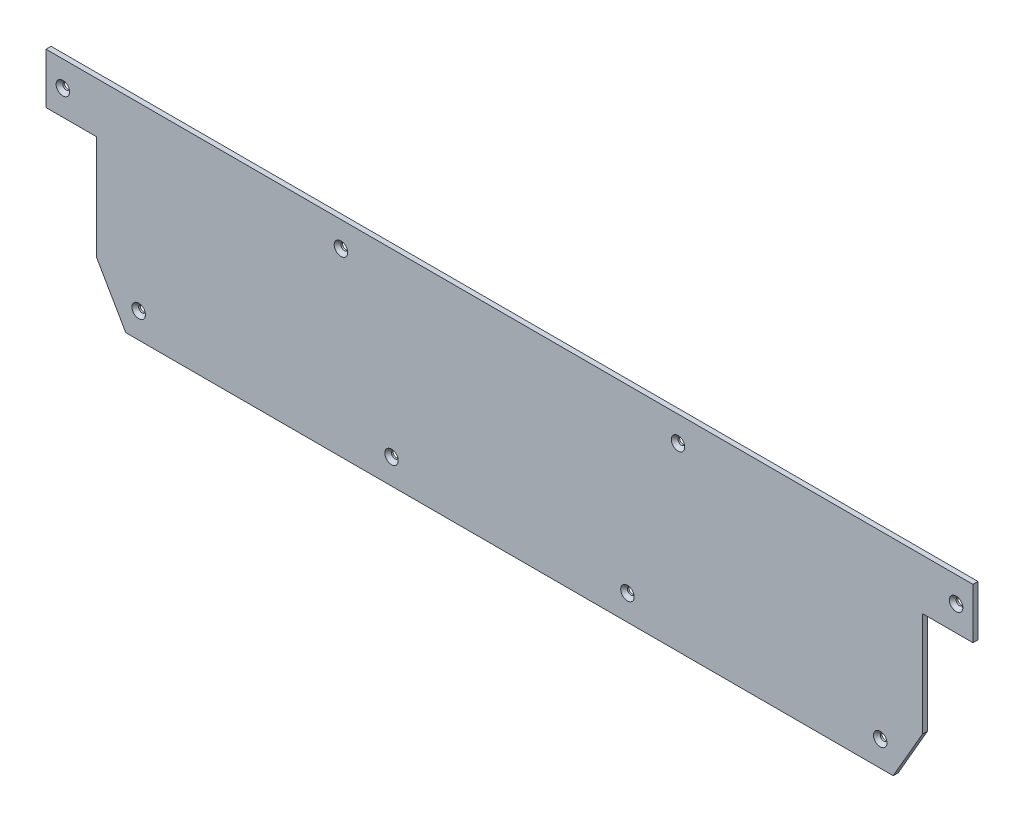
ISO-10303-21;
HEADER;
FILE_DESCRIPTION(('STEP AP214'),'2;1');
FILE_NAME('part.step','',(''),(''),'','','');
FILE_SCHEMA(('AUTOMOTIVE_DESIGN { 1 0 10303 214 1 1 1 1 }'));
ENDSEC;
DATA;
#1=APPLICATION_CONTEXT('core data for automotive mechanical design processes');
#2=APPLICATION_PROTOCOL_DEFINITION('international standard','automotive_design',2000,#1);
#3=PRODUCT_CONTEXT('',#1,'mechanical');
#4=PRODUCT('Part','Part','',(#3));
#5=PRODUCT_RELATED_PRODUCT_CATEGORY('part','',(#4));
#6=PRODUCT_DEFINITION_FORMATION('','',#4);
#7=PRODUCT_DEFINITION_CONTEXT('part definition',#1,'design');
#8=PRODUCT_DEFINITION('design','',#6,#7);
#9=PRODUCT_DEFINITION_SHAPE('','',#8);
#10=(LENGTH_UNIT() NAMED_UNIT(*) SI_UNIT(.MILLI.,.METRE.));
#11=(NAMED_UNIT(*) PLANE_ANGLE_UNIT() SI_UNIT($,.RADIAN.));
#12=(NAMED_UNIT(*) SI_UNIT($,.STERADIAN.) SOLID_ANGLE_UNIT());
#13=UNCERTAINTY_MEASURE_WITH_UNIT(LENGTH_MEASURE(1.E-05),#10,'distance_accuracy_value','');
#14=(GEOMETRIC_REPRESENTATION_CONTEXT(3) GLOBAL_UNCERTAINTY_ASSIGNED_CONTEXT((#13)) GLOBAL_UNIT_ASSIGNED_CONTEXT((#10,
#11,#12)) REPRESENTATION_CONTEXT('',''));
#15=CARTESIAN_POINT('',(0.,0.,0.));
#16=DIRECTION('',(0.,0.,1.));
#17=DIRECTION('',(1.,0.,0.));
#18=AXIS2_PLACEMENT_3D('',#15,#16,#17);
#19=CARTESIAN_POINT('',(-275.,61.,3.));
#20=DIRECTION('',(1.,0.,0.));
#21=DIRECTION('',(0.,0.,-1.));
#22=AXIS2_PLACEMENT_3D('',#19,#20,#21);
#23=PLANE('',#22);
#24=DIRECTION('',(0.,-1.,0.));
#25=VECTOR('',#24,1.);
#26=CARTESIAN_POINT('',(-275.,61.,0.));
#27=LINE('',#26,#25);
#28=CARTESIAN_POINT('',(-275.,61.,0.));
#29=VERTEX_POINT('',#28);
#30=CARTESIAN_POINT('',(-275.,31.,0.));
#31=VERTEX_POINT('',#30);
#32=EDGE_CURVE('E138',#29,#31,#27,.T.);
#33=ORIENTED_EDGE('',*,*,#32,.T.);
#34=DIRECTION('',(0.,0.,1.));
#35=VECTOR('',#34,1.);
#36=CARTESIAN_POINT('',(-275.,31.,0.));
#37=LINE('',#36,#35);
#38=CARTESIAN_POINT('',(-275.,31.,3.));
#39=VERTEX_POINT('',#38);
#40=EDGE_CURVE('E143',#31,#39,#37,.T.);
#41=ORIENTED_EDGE('',*,*,#40,.T.);
#42=DIRECTION('',(0.,-1.,0.));
#43=VECTOR('',#42,1.);
#44=CARTESIAN_POINT('',(-275.,61.,3.));
#45=LINE('',#44,#43);
#46=CARTESIAN_POINT('',(-275.,61.,3.));
#47=VERTEX_POINT('',#46);
#48=EDGE_CURVE('E148',#47,#39,#45,.T.);
#49=ORIENTED_EDGE('',*,*,#48,.F.);
#50=DIRECTION('',(0.,0.,-1.));
#51=VECTOR('',#50,1.);
#52=CARTESIAN_POINT('',(-275.,61.,3.));
#53=LINE('',#52,#51);
#54=EDGE_CURVE('E149',#47,#29,#53,.T.);
#55=ORIENTED_EDGE('',*,*,#54,.T.);
#56=EDGE_LOOP('',(#33,#41,#49,#55));
#57=FACE_BOUND('',#56,.T.);
#58=ADVANCED_FACE('F36',(#57),#23,.F.);
#59=CARTESIAN_POINT('',(-275.,-61.,3.));
#60=DIRECTION('',(0.,1.,0.));
#61=DIRECTION('',(0.,0.,1.));
#62=AXIS2_PLACEMENT_3D('',#59,#60,#61);
#63=PLANE('',#62);
#64=DIRECTION('',(1.,0.,0.));
#65=VECTOR('',#64,1.);
#66=CARTESIAN_POINT('',(-275.,-61.,3.));
#67=LINE('',#66,#65);
#68=CARTESIAN_POINT('',(-227.679491924311,-61.,3.));
#69=VERTEX_POINT('',#68);
#70=CARTESIAN_POINT('',(227.679491924311,-60.9999999999999,3.));
#71=VERTEX_POINT('',#70);
#72=EDGE_CURVE('E131',#69,#71,#67,.T.);
#73=ORIENTED_EDGE('',*,*,#72,.F.);
#74=DIRECTION('',(0.,0.,1.));
#75=VECTOR('',#74,1.);
#76=CARTESIAN_POINT('',(-227.679491924311,-61.,0.));
#77=LINE('',#76,#75);
#78=CARTESIAN_POINT('',(-227.679491924311,-61.,0.));
#79=VERTEX_POINT('',#78);
#80=EDGE_CURVE('E118',#79,#69,#77,.T.);
#81=ORIENTED_EDGE('',*,*,#80,.F.);
#82=DIRECTION('',(1.,0.,0.));
#83=VECTOR('',#82,1.);
#84=CARTESIAN_POINT('',(-275.,-61.,0.));
#85=LINE('',#84,#83);
#86=CARTESIAN_POINT('',(227.679491924311,-61.,0.));
#87=VERTEX_POINT('',#86);
#88=EDGE_CURVE('E129',#79,#87,#85,.T.);
#89=ORIENTED_EDGE('',*,*,#88,.T.);
#90=DIRECTION('',(0.,0.,1.));
#91=VECTOR('',#90,1.);
#92=CARTESIAN_POINT('',(227.679491924311,-60.9999999999999,0.));
#93=LINE('',#92,#91);
#94=EDGE_CURVE('E60',#87,#71,#93,.T.);
#95=ORIENTED_EDGE('',*,*,#94,.T.);
#96=EDGE_LOOP('',(#73,#81,#89,#95));
#97=FACE_BOUND('',#96,.T.);
#98=ADVANCED_FACE('F128',(#97),#63,.F.);
#99=CARTESIAN_POINT('',(275.,61.,3.));
#100=DIRECTION('',(-1.,0.,0.));
#101=DIRECTION('',(0.,0.,1.));
#102=AXIS2_PLACEMENT_3D('',#99,#100,#101);
#103=PLANE('',#102);
#104=DIRECTION('',(0.,1.,0.));
#105=VECTOR('',#104,1.);
#106=CARTESIAN_POINT('',(275.,61.,3.));
#107=LINE('',#106,#105);
#108=CARTESIAN_POINT('',(275.,31.0000000000001,3.));
#109=VERTEX_POINT('',#108);
#110=CARTESIAN_POINT('',(275.,61.,3.));
#111=VERTEX_POINT('',#110);
#112=EDGE_CURVE('E258',#109,#111,#107,.T.);
#113=ORIENTED_EDGE('',*,*,#112,.F.);
#114=DIRECTION('',(0.,0.,1.));
#115=VECTOR('',#114,1.);
#116=CARTESIAN_POINT('',(275.,31.0000000000001,0.));
#117=LINE('',#116,#115);
#118=CARTESIAN_POINT('',(275.,31.0000000000001,0.));
#119=VERTEX_POINT('',#118);
#120=EDGE_CURVE('E252',#119,#109,#117,.T.);
#121=ORIENTED_EDGE('',*,*,#120,.F.);
#122=DIRECTION('',(0.,1.,0.));
#123=VECTOR('',#122,1.);
#124=CARTESIAN_POINT('',(275.,61.,0.));
#125=LINE('',#124,#123);
#126=CARTESIAN_POINT('',(275.,61.,0.));
#127=VERTEX_POINT('',#126);
#128=EDGE_CURVE('E137',#119,#127,#125,.T.);
#129=ORIENTED_EDGE('',*,*,#128,.T.);
#130=DIRECTION('',(0.,0.,-1.));
#131=VECTOR('',#130,1.);
#132=CARTESIAN_POINT('',(275.,61.,3.));
#133=LINE('',#132,#131);
#134=EDGE_CURVE('E152',#111,#127,#133,.T.);
#135=ORIENTED_EDGE('',*,*,#134,.F.);
#136=EDGE_LOOP('',(#113,#121,#129,#135));
#137=FACE_BOUND('',#136,.T.);
#138=ADVANCED_FACE('F283',(#137),#103,.F.);
#139=CARTESIAN_POINT('',(-275.,61.,3.));
#140=DIRECTION('',(0.,-1.,0.));
#141=DIRECTION('',(0.,0.,-1.));
#142=AXIS2_PLACEMENT_3D('',#139,#140,#141);
#143=PLANE('',#142);
#144=DIRECTION('',(-1.,0.,0.));
#145=VECTOR('',#144,1.);
#146=CARTESIAN_POINT('',(-275.,61.,0.));
#147=LINE('',#146,#145);
#148=EDGE_CURVE('E140',#127,#29,#147,.T.);
#149=ORIENTED_EDGE('',*,*,#148,.T.);
#150=ORIENTED_EDGE('',*,*,#54,.F.);
#151=DIRECTION('',(-1.,0.,0.));
#152=VECTOR('',#151,1.);
#153=CARTESIAN_POINT('',(-275.,61.,3.));
#154=LINE('',#153,#152);
#155=EDGE_CURVE('E153',#111,#47,#154,.T.);
#156=ORIENTED_EDGE('',*,*,#155,.F.);
#157=ORIENTED_EDGE('',*,*,#134,.T.);
#158=EDGE_LOOP('',(#149,#150,#156,#157));
#159=FACE_BOUND('',#158,.T.);
#160=ADVANCED_FACE('F212',(#159),#143,.F.);
#161=CARTESIAN_POINT('',(0.,0.,3.));
#162=DIRECTION('',(0.,0.,1.));
#163=DIRECTION('',(1.,0.,0.));
#164=AXIS2_PLACEMENT_3D('',#161,#162,#163);
#165=PLANE('',#164);
#166=CARTESIAN_POINT('',(70.,-46.,3.));
#167=DIRECTION('',(0.,0.,1.));
#168=DIRECTION('',(1.,0.,0.));
#169=AXIS2_PLACEMENT_3D('',#166,#167,#168);
#170=CIRCLE('',#169,3.99999999999989);
#171=CARTESIAN_POINT('',(73.9999999999999,-46.,3.));
#172=VERTEX_POINT('',#171);
#173=EDGE_CURVE('E177',#172,#172,#170,.F.);
#174=ORIENTED_EDGE('',*,*,#173,.T.);
#175=EDGE_LOOP('',(#174));
#176=FACE_BOUND('',#175,.T.);
#177=CARTESIAN_POINT('',(220.,-46.,3.));
#178=DIRECTION('',(0.,0.,1.));
#179=DIRECTION('',(1.,0.,0.));
#180=AXIS2_PLACEMENT_3D('',#177,#178,#179);
#181=CIRCLE('',#180,4.);
#182=CARTESIAN_POINT('',(224.,-46.,3.));
#183=VERTEX_POINT('',#182);
#184=EDGE_CURVE('E174',#183,#183,#181,.F.);
#185=ORIENTED_EDGE('',*,*,#184,.T.);
#186=EDGE_LOOP('',(#185));
#187=FACE_BOUND('',#186,.T.);
#188=CARTESIAN_POINT('',(265.,46.0000000000001,3.));
#189=DIRECTION('',(0.,0.,1.));
#190=DIRECTION('',(1.,0.,0.));
#191=AXIS2_PLACEMENT_3D('',#188,#189,#190);
#192=CIRCLE('',#191,3.99999999999984);
#193=CARTESIAN_POINT('',(269.,46.0000000000001,3.));
#194=VERTEX_POINT('',#193);
#195=EDGE_CURVE('E171',#194,#194,#192,.F.);
#196=ORIENTED_EDGE('',*,*,#195,.T.);
#197=EDGE_LOOP('',(#196));
#198=FACE_BOUND('',#197,.T.);
#199=CARTESIAN_POINT('',(100.,46.,3.));
#200=DIRECTION('',(0.,0.,1.));
#201=DIRECTION('',(1.,0.,0.));
#202=AXIS2_PLACEMENT_3D('',#199,#200,#201);
#203=CIRCLE('',#202,3.99999999999989);
#204=CARTESIAN_POINT('',(104.,46.,3.));
#205=VERTEX_POINT('',#204);
#206=EDGE_CURVE('E168',#205,#205,#203,.F.);
#207=ORIENTED_EDGE('',*,*,#206,.T.);
#208=EDGE_LOOP('',(#207));
#209=FACE_BOUND('',#208,.T.);
#210=CARTESIAN_POINT('',(-70.,-46.,3.));
#211=DIRECTION('',(0.,0.,1.));
#212=DIRECTION('',(1.,0.,0.));
#213=AXIS2_PLACEMENT_3D('',#210,#211,#212);
#214=CIRCLE('',#213,3.99999999999989);
#215=CARTESIAN_POINT('',(-66.0000000000001,-46.,3.));
#216=VERTEX_POINT('',#215);
#217=EDGE_CURVE('E165',#216,#216,#214,.F.);
#218=ORIENTED_EDGE('',*,*,#217,.T.);
#219=EDGE_LOOP('',(#218));
#220=FACE_BOUND('',#219,.T.);
#221=CARTESIAN_POINT('',(-220.,-46.,3.));
#222=DIRECTION('',(0.,0.,1.));
#223=DIRECTION('',(1.,0.,0.));
#224=AXIS2_PLACEMENT_3D('',#221,#222,#223);
#225=CIRCLE('',#224,4.);
#226=CARTESIAN_POINT('',(-216.,-46.,3.));
#227=VERTEX_POINT('',#226);
#228=EDGE_CURVE('E162',#227,#227,#225,.F.);
#229=ORIENTED_EDGE('',*,*,#228,.T.);
#230=EDGE_LOOP('',(#229));
#231=FACE_BOUND('',#230,.T.);
#232=CARTESIAN_POINT('',(-100.,46.,3.));
#233=DIRECTION('',(0.,0.,1.));
#234=DIRECTION('',(1.,0.,0.));
#235=AXIS2_PLACEMENT_3D('',#232,#233,#234);
#236=CIRCLE('',#235,4.00000000000006);
#237=CARTESIAN_POINT('',(-95.9999999999999,46.,3.));
#238=VERTEX_POINT('',#237);
#239=EDGE_CURVE('E159',#238,#238,#236,.F.);
#240=ORIENTED_EDGE('',*,*,#239,.T.);
#241=EDGE_LOOP('',(#240));
#242=FACE_BOUND('',#241,.T.);
#243=CARTESIAN_POINT('',(-265.,46.,3.));
#244=DIRECTION('',(0.,0.,1.));
#245=DIRECTION('',(1.,0.,0.));
#246=AXIS2_PLACEMENT_3D('',#243,#244,#245);
#247=CIRCLE('',#246,4.);
#248=CARTESIAN_POINT('',(-261.,46.,3.));
#249=VERTEX_POINT('',#248);
#250=EDGE_CURVE('E156',#249,#249,#247,.F.);
#251=ORIENTED_EDGE('',*,*,#250,.T.);
#252=EDGE_LOOP('',(#251));
#253=FACE_BOUND('',#252,.T.);
#254=DIRECTION('',(-1.,0.,0.));
#255=VECTOR('',#254,1.);
#256=CARTESIAN_POINT('',(-275.,31.,3.));
#257=LINE('',#256,#255);
#258=CARTESIAN_POINT('',(-245.,31.,3.));
#259=VERTEX_POINT('',#258);
#260=EDGE_CURVE('E123',#259,#39,#257,.T.);
#261=ORIENTED_EDGE('',*,*,#260,.F.);
#262=DIRECTION('',(0.,1.,0.));
#263=VECTOR('',#262,1.);
#264=CARTESIAN_POINT('',(-245.,31.,3.));
#265=LINE('',#264,#263);
#266=CARTESIAN_POINT('',(-245.,-31.,3.));
#267=VERTEX_POINT('',#266);
#268=EDGE_CURVE('E221',#267,#259,#265,.T.);
#269=ORIENTED_EDGE('',*,*,#268,.F.);
#270=DIRECTION('',(-0.499999999999998,0.86602540378444,0.));
#271=VECTOR('',#270,1.);
#272=CARTESIAN_POINT('',(-245.,-31.,3.));
#273=LINE('',#272,#271);
#274=EDGE_CURVE('E226',#69,#267,#273,.T.);
#275=ORIENTED_EDGE('',*,*,#274,.F.);
#276=ORIENTED_EDGE('',*,*,#72,.T.);
#277=DIRECTION('',(-0.499999999999996,-0.866025403784441,0.));
#278=VECTOR('',#277,1.);
#279=CARTESIAN_POINT('',(245.,-30.9999999999999,3.));
#280=LINE('',#279,#278);
#281=CARTESIAN_POINT('',(245.,-30.9999999999999,3.));
#282=VERTEX_POINT('',#281);
#283=EDGE_CURVE('E245',#282,#71,#280,.T.);
#284=ORIENTED_EDGE('',*,*,#283,.F.);
#285=DIRECTION('',(0.,-1.,0.));
#286=VECTOR('',#285,1.);
#287=CARTESIAN_POINT('',(245.,31.0000000000001,3.));
#288=LINE('',#287,#286);
#289=CARTESIAN_POINT('',(245.,31.0000000000001,3.));
#290=VERTEX_POINT('',#289);
#291=EDGE_CURVE('E242',#290,#282,#288,.T.);
#292=ORIENTED_EDGE('',*,*,#291,.F.);
#293=DIRECTION('',(-1.,0.,0.));
#294=VECTOR('',#293,1.);
#295=CARTESIAN_POINT('',(275.,31.0000000000001,3.));
#296=LINE('',#295,#294);
#297=EDGE_CURVE('E236',#109,#290,#296,.T.);
#298=ORIENTED_EDGE('',*,*,#297,.F.);
#299=ORIENTED_EDGE('',*,*,#112,.T.);
#300=ORIENTED_EDGE('',*,*,#155,.T.);
#301=ORIENTED_EDGE('',*,*,#48,.T.);
#302=EDGE_LOOP('',(#261,#269,#275,#276,#284,#292,#298,#299,#300,#301));
#303=FACE_BOUND('',#302,.T.);
#304=ADVANCED_FACE('F209',(#176,#187,#198,#209,#220,#231,#242,#253,#303),#165,.T.);
#305=CARTESIAN_POINT('',(0.,0.,0.));
#306=DIRECTION('',(0.,0.,1.));
#307=DIRECTION('',(1.,0.,0.));
#308=AXIS2_PLACEMENT_3D('',#305,#306,#307);
#309=PLANE('',#308);
#310=CARTESIAN_POINT('',(-220.,-46.,0.));
#311=DIRECTION('',(0.,0.,1.));
#312=DIRECTION('',(1.,0.,0.));
#313=AXIS2_PLACEMENT_3D('',#310,#311,#312);
#314=CIRCLE('',#313,2.);
#315=CARTESIAN_POINT('',(-218.,-46.,0.));
#316=VERTEX_POINT('',#315);
#317=EDGE_CURVE('E357',#316,#316,#314,.T.);
#318=ORIENTED_EDGE('',*,*,#317,.T.);
#319=EDGE_LOOP('',(#318));
#320=FACE_BOUND('',#319,.T.);
#321=CARTESIAN_POINT('',(100.,46.,0.));
#322=DIRECTION('',(0.,0.,1.));
#323=DIRECTION('',(-1.,0.,0.));
#324=AXIS2_PLACEMENT_3D('',#321,#322,#323);
#325=CIRCLE('',#324,2.);
#326=CARTESIAN_POINT('',(98.,46.,0.));
#327=VERTEX_POINT('',#326);
#328=EDGE_CURVE('E359',#327,#327,#325,.T.);
#329=ORIENTED_EDGE('',*,*,#328,.T.);
#330=EDGE_LOOP('',(#329));
#331=FACE_BOUND('',#330,.T.);
#332=CARTESIAN_POINT('',(265.,46.0000000000001,0.));
#333=DIRECTION('',(0.,0.,1.));
#334=DIRECTION('',(-1.,0.,0.));
#335=AXIS2_PLACEMENT_3D('',#332,#333,#334);
#336=CIRCLE('',#335,2.);
#337=CARTESIAN_POINT('',(263.,46.0000000000001,0.));
#338=VERTEX_POINT('',#337);
#339=EDGE_CURVE('E363',#338,#338,#336,.T.);
#340=ORIENTED_EDGE('',*,*,#339,.T.);
#341=EDGE_LOOP('',(#340));
#342=FACE_BOUND('',#341,.T.);
#343=CARTESIAN_POINT('',(-265.,46.,0.));
#344=DIRECTION('',(0.,0.,1.));
#345=DIRECTION('',(1.,0.,0.));
#346=AXIS2_PLACEMENT_3D('',#343,#344,#345);
#347=CIRCLE('',#346,2.);
#348=CARTESIAN_POINT('',(-263.,46.,0.));
#349=VERTEX_POINT('',#348);
#350=EDGE_CURVE('E370',#349,#349,#347,.T.);
#351=ORIENTED_EDGE('',*,*,#350,.T.);
#352=EDGE_LOOP('',(#351));
#353=FACE_BOUND('',#352,.T.);
#354=CARTESIAN_POINT('',(-70.,-46.,0.));
#355=DIRECTION('',(0.,0.,1.));
#356=DIRECTION('',(1.,0.,0.));
#357=AXIS2_PLACEMENT_3D('',#354,#355,#356);
#358=CIRCLE('',#357,2.);
#359=CARTESIAN_POINT('',(-68.,-46.,0.));
#360=VERTEX_POINT('',#359);
#361=EDGE_CURVE('E360',#360,#360,#358,.T.);
#362=ORIENTED_EDGE('',*,*,#361,.T.);
#363=EDGE_LOOP('',(#362));
#364=FACE_BOUND('',#363,.T.);
#365=CARTESIAN_POINT('',(70.,-46.,0.));
#366=DIRECTION('',(0.,0.,1.));
#367=DIRECTION('',(-1.,0.,0.));
#368=AXIS2_PLACEMENT_3D('',#365,#366,#367);
#369=CIRCLE('',#368,2.);
#370=CARTESIAN_POINT('',(68.,-46.,0.));
#371=VERTEX_POINT('',#370);
#372=EDGE_CURVE('E366',#371,#371,#369,.T.);
#373=ORIENTED_EDGE('',*,*,#372,.T.);
#374=EDGE_LOOP('',(#373));
#375=FACE_BOUND('',#374,.T.);
#376=CARTESIAN_POINT('',(220.,-46.,0.));
#377=DIRECTION('',(0.,0.,1.));
#378=DIRECTION('',(-1.,0.,0.));
#379=AXIS2_PLACEMENT_3D('',#376,#377,#378);
#380=CIRCLE('',#379,2.);
#381=CARTESIAN_POINT('',(218.,-46.,0.));
#382=VERTEX_POINT('',#381);
#383=EDGE_CURVE('E421',#382,#382,#380,.T.);
#384=ORIENTED_EDGE('',*,*,#383,.T.);
#385=EDGE_LOOP('',(#384));
#386=FACE_BOUND('',#385,.T.);
#387=CARTESIAN_POINT('',(-100.,46.,0.));
#388=DIRECTION('',(0.,0.,1.));
#389=DIRECTION('',(1.,0.,0.));
#390=AXIS2_PLACEMENT_3D('',#387,#388,#389);
#391=CIRCLE('',#390,2.);
#392=CARTESIAN_POINT('',(-98.,46.,0.));
#393=VERTEX_POINT('',#392);
#394=EDGE_CURVE('E246',#393,#393,#391,.T.);
#395=ORIENTED_EDGE('',*,*,#394,.T.);
#396=EDGE_LOOP('',(#395));
#397=FACE_BOUND('',#396,.T.);
#398=DIRECTION('',(0.,1.,0.));
#399=VECTOR('',#398,1.);
#400=CARTESIAN_POINT('',(-245.,31.,0.));
#401=LINE('',#400,#399);
#402=CARTESIAN_POINT('',(-245.,-31.,0.));
#403=VERTEX_POINT('',#402);
#404=CARTESIAN_POINT('',(-245.,31.,0.));
#405=VERTEX_POINT('',#404);
#406=EDGE_CURVE('E52',#403,#405,#401,.T.);
#407=ORIENTED_EDGE('',*,*,#406,.T.);
#408=DIRECTION('',(-1.,0.,0.));
#409=VECTOR('',#408,1.);
#410=CARTESIAN_POINT('',(-275.,31.,0.));
#411=LINE('',#410,#409);
#412=EDGE_CURVE('E132',#405,#31,#411,.T.);
#413=ORIENTED_EDGE('',*,*,#412,.T.);
#414=ORIENTED_EDGE('',*,*,#32,.F.);
#415=ORIENTED_EDGE('',*,*,#148,.F.);
#416=ORIENTED_EDGE('',*,*,#128,.F.);
#417=DIRECTION('',(-1.,0.,0.));
#418=VECTOR('',#417,1.);
#419=CARTESIAN_POINT('',(275.,31.0000000000001,0.));
#420=LINE('',#419,#418);
#421=CARTESIAN_POINT('',(245.,31.0000000000001,0.));
#422=VERTEX_POINT('',#421);
#423=EDGE_CURVE('E238',#119,#422,#420,.T.);
#424=ORIENTED_EDGE('',*,*,#423,.T.);
#425=DIRECTION('',(0.,-1.,0.));
#426=VECTOR('',#425,1.);
#427=CARTESIAN_POINT('',(245.,31.0000000000001,0.));
#428=LINE('',#427,#426);
#429=CARTESIAN_POINT('',(245.,-30.9999999999999,0.));
#430=VERTEX_POINT('',#429);
#431=EDGE_CURVE('E234',#422,#430,#428,.T.);
#432=ORIENTED_EDGE('',*,*,#431,.T.);
#433=DIRECTION('',(-0.499999999999996,-0.866025403784441,0.));
#434=VECTOR('',#433,1.);
#435=CARTESIAN_POINT('',(245.,-30.9999999999999,0.));
#436=LINE('',#435,#434);
#437=EDGE_CURVE('E136',#430,#87,#436,.T.);
#438=ORIENTED_EDGE('',*,*,#437,.T.);
#439=ORIENTED_EDGE('',*,*,#88,.F.);
#440=DIRECTION('',(-0.499999999999998,0.86602540378444,0.));
#441=VECTOR('',#440,1.);
#442=CARTESIAN_POINT('',(-245.,-31.,0.));
#443=LINE('',#442,#441);
#444=EDGE_CURVE('E114',#79,#403,#443,.T.);
#445=ORIENTED_EDGE('',*,*,#444,.T.);
#446=EDGE_LOOP('',(#407,#413,#414,#415,#416,#424,#432,#438,#439,#445));
#447=FACE_BOUND('',#446,.T.);
#448=ADVANCED_FACE('F134',(#320,#331,#342,#353,#364,#375,#386,#397,#447),#309,.F.);
#449=CARTESIAN_POINT('',(245.,31.0000000000001,0.));
#450=DIRECTION('',(-1.,0.,0.));
#451=DIRECTION('',(0.,0.,1.));
#452=AXIS2_PLACEMENT_3D('',#449,#450,#451);
#453=PLANE('',#452);
#454=ORIENTED_EDGE('',*,*,#291,.T.);
#455=DIRECTION('',(0.,0.,1.));
#456=VECTOR('',#455,1.);
#457=CARTESIAN_POINT('',(245.,-30.9999999999999,0.));
#458=LINE('',#457,#456);
#459=EDGE_CURVE('E241',#430,#282,#458,.T.);
#460=ORIENTED_EDGE('',*,*,#459,.F.);
#461=ORIENTED_EDGE('',*,*,#431,.F.);
#462=DIRECTION('',(0.,0.,1.));
#463=VECTOR('',#462,1.);
#464=CARTESIAN_POINT('',(245.,31.0000000000001,0.));
#465=LINE('',#464,#463);
#466=EDGE_CURVE('E250',#422,#290,#465,.T.);
#467=ORIENTED_EDGE('',*,*,#466,.T.);
#468=EDGE_LOOP('',(#454,#460,#461,#467));
#469=FACE_BOUND('',#468,.T.);
#470=ADVANCED_FACE('F278',(#469),#453,.F.);
#471=CARTESIAN_POINT('',(275.,31.0000000000001,0.));
#472=DIRECTION('',(0.,1.,0.));
#473=DIRECTION('',(-1.,0.,0.));
#474=AXIS2_PLACEMENT_3D('',#471,#472,#473);
#475=PLANE('',#474);
#476=ORIENTED_EDGE('',*,*,#297,.T.);
#477=ORIENTED_EDGE('',*,*,#466,.F.);
#478=ORIENTED_EDGE('',*,*,#423,.F.);
#479=ORIENTED_EDGE('',*,*,#120,.T.);
#480=EDGE_LOOP('',(#476,#477,#478,#479));
#481=FACE_BOUND('',#480,.T.);
#482=ADVANCED_FACE('F280',(#481),#475,.F.);
#483=CARTESIAN_POINT('',(245.,-30.9999999999999,0.));
#484=DIRECTION('',(-0.866025403784441,0.499999999999996,0.));
#485=DIRECTION('',(-0.499999999999996,-0.866025403784441,0.));
#486=AXIS2_PLACEMENT_3D('',#483,#484,#485);
#487=PLANE('',#486);
#488=ORIENTED_EDGE('',*,*,#283,.T.);
#489=ORIENTED_EDGE('',*,*,#94,.F.);
#490=ORIENTED_EDGE('',*,*,#437,.F.);
#491=ORIENTED_EDGE('',*,*,#459,.T.);
#492=EDGE_LOOP('',(#488,#489,#490,#491));
#493=FACE_BOUND('',#492,.T.);
#494=ADVANCED_FACE('F275',(#493),#487,.F.);
#495=CARTESIAN_POINT('',(-275.,31.,0.));
#496=DIRECTION('',(0.,1.,0.));
#497=DIRECTION('',(-1.,0.,0.));
#498=AXIS2_PLACEMENT_3D('',#495,#496,#497);
#499=PLANE('',#498);
#500=ORIENTED_EDGE('',*,*,#260,.T.);
#501=ORIENTED_EDGE('',*,*,#40,.F.);
#502=ORIENTED_EDGE('',*,*,#412,.F.);
#503=DIRECTION('',(0.,0.,1.));
#504=VECTOR('',#503,1.);
#505=CARTESIAN_POINT('',(-245.,31.,0.));
#506=LINE('',#505,#504);
#507=EDGE_CURVE('E231',#405,#259,#506,.T.);
#508=ORIENTED_EDGE('',*,*,#507,.T.);
#509=EDGE_LOOP('',(#500,#501,#502,#508));
#510=FACE_BOUND('',#509,.T.);
#511=ADVANCED_FACE('F270',(#510),#499,.F.);
#512=CARTESIAN_POINT('',(-245.,31.,0.));
#513=DIRECTION('',(1.,0.,0.));
#514=DIRECTION('',(0.,0.,-1.));
#515=AXIS2_PLACEMENT_3D('',#512,#513,#514);
#516=PLANE('',#515);
#517=ORIENTED_EDGE('',*,*,#268,.T.);
#518=ORIENTED_EDGE('',*,*,#507,.F.);
#519=ORIENTED_EDGE('',*,*,#406,.F.);
#520=DIRECTION('',(0.,0.,1.));
#521=VECTOR('',#520,1.);
#522=CARTESIAN_POINT('',(-245.,-31.,0.));
#523=LINE('',#522,#521);
#524=EDGE_CURVE('E120',#403,#267,#523,.T.);
#525=ORIENTED_EDGE('',*,*,#524,.T.);
#526=EDGE_LOOP('',(#517,#518,#519,#525));
#527=FACE_BOUND('',#526,.T.);
#528=ADVANCED_FACE('F388',(#527),#516,.F.);
#529=CARTESIAN_POINT('',(-245.,-31.,0.));
#530=DIRECTION('',(0.86602540378444,0.499999999999998,0.));
#531=DIRECTION('',(-0.499999999999998,0.86602540378444,0.));
#532=AXIS2_PLACEMENT_3D('',#529,#530,#531);
#533=PLANE('',#532);
#534=ORIENTED_EDGE('',*,*,#274,.T.);
#535=ORIENTED_EDGE('',*,*,#524,.F.);
#536=ORIENTED_EDGE('',*,*,#444,.F.);
#537=ORIENTED_EDGE('',*,*,#80,.T.);
#538=EDGE_LOOP('',(#534,#535,#536,#537));
#539=FACE_BOUND('',#538,.T.);
#540=ADVANCED_FACE('F117',(#539),#533,.F.);
#541=CARTESIAN_POINT('',(-100.,46.,10.));
#542=DIRECTION('',(0.,0.,-1.));
#543=DIRECTION('',(-1.,0.,0.));
#544=AXIS2_PLACEMENT_3D('',#541,#542,#543);
#545=CYLINDRICAL_SURFACE('',#544,2.);
#546=CARTESIAN_POINT('',(-100.,46.,0.999999999999902));
#547=DIRECTION('',(0.,0.,1.));
#548=DIRECTION('',(1.,0.,0.));
#549=AXIS2_PLACEMENT_3D('',#546,#547,#548);
#550=CIRCLE('',#549,2.);
#551=CARTESIAN_POINT('',(-98.,46.,0.999999999999902));
#552=VERTEX_POINT('',#551);
#553=EDGE_CURVE('E45',#552,#552,#550,.T.);
#554=ORIENTED_EDGE('',*,*,#553,.T.);
#555=EDGE_LOOP('',(#554));
#556=FACE_BOUND('',#555,.T.);
#557=ORIENTED_EDGE('',*,*,#394,.F.);
#558=EDGE_LOOP('',(#557));
#559=FACE_BOUND('',#558,.T.);
#560=ADVANCED_FACE('F200',(#556,#559),#545,.F.);
#561=CARTESIAN_POINT('',(220.,-46.,10.));
#562=DIRECTION('',(0.,0.,-1.));
#563=DIRECTION('',(-1.,0.,0.));
#564=AXIS2_PLACEMENT_3D('',#561,#562,#563);
#565=CYLINDRICAL_SURFACE('',#564,2.);
#566=CARTESIAN_POINT('',(220.,-46.,0.999999999999985));
#567=DIRECTION('',(0.,0.,1.));
#568=DIRECTION('',(1.,0.,0.));
#569=AXIS2_PLACEMENT_3D('',#566,#567,#568);
#570=CIRCLE('',#569,2.);
#571=CARTESIAN_POINT('',(222.,-46.,0.999999999999985));
#572=VERTEX_POINT('',#571);
#573=EDGE_CURVE('E183',#572,#572,#570,.T.);
#574=ORIENTED_EDGE('',*,*,#573,.T.);
#575=EDGE_LOOP('',(#574));
#576=FACE_BOUND('',#575,.T.);
#577=ORIENTED_EDGE('',*,*,#383,.F.);
#578=EDGE_LOOP('',(#577));
#579=FACE_BOUND('',#578,.T.);
#580=ADVANCED_FACE('F379',(#576,#579),#565,.F.);
#581=CARTESIAN_POINT('',(70.,-46.,10.));
#582=DIRECTION('',(0.,0.,-1.));
#583=DIRECTION('',(-1.,0.,0.));
#584=AXIS2_PLACEMENT_3D('',#581,#582,#583);
#585=CYLINDRICAL_SURFACE('',#584,2.);
#586=CARTESIAN_POINT('',(70.,-46.,1.00000000000007));
#587=DIRECTION('',(0.,0.,1.));
#588=DIRECTION('',(1.,0.,0.));
#589=AXIS2_PLACEMENT_3D('',#586,#587,#588);
#590=CIRCLE('',#589,2.);
#591=CARTESIAN_POINT('',(72.,-46.,1.00000000000007));
#592=VERTEX_POINT('',#591);
#593=EDGE_CURVE('E180',#592,#592,#590,.T.);
#594=ORIENTED_EDGE('',*,*,#593,.T.);
#595=EDGE_LOOP('',(#594));
#596=FACE_BOUND('',#595,.T.);
#597=ORIENTED_EDGE('',*,*,#372,.F.);
#598=EDGE_LOOP('',(#597));
#599=FACE_BOUND('',#598,.T.);
#600=ADVANCED_FACE('F385',(#596,#599),#585,.F.);
#601=CARTESIAN_POINT('',(-70.,-46.,10.));
#602=DIRECTION('',(0.,0.,-1.));
#603=DIRECTION('',(-1.,0.,0.));
#604=AXIS2_PLACEMENT_3D('',#601,#602,#603);
#605=CYLINDRICAL_SURFACE('',#604,2.);
#606=CARTESIAN_POINT('',(-70.,-46.,1.00000000000007));
#607=DIRECTION('',(0.,0.,1.));
#608=DIRECTION('',(1.,0.,0.));
#609=AXIS2_PLACEMENT_3D('',#606,#607,#608);
#610=CIRCLE('',#609,2.);
#611=CARTESIAN_POINT('',(-68.,-46.,1.00000000000007));
#612=VERTEX_POINT('',#611);
#613=EDGE_CURVE('E192',#612,#612,#610,.T.);
#614=ORIENTED_EDGE('',*,*,#613,.T.);
#615=EDGE_LOOP('',(#614));
#616=FACE_BOUND('',#615,.T.);
#617=ORIENTED_EDGE('',*,*,#361,.F.);
#618=EDGE_LOOP('',(#617));
#619=FACE_BOUND('',#618,.T.);
#620=ADVANCED_FACE('F426',(#616,#619),#605,.F.);
#621=CARTESIAN_POINT('',(-265.,46.,10.));
#622=DIRECTION('',(0.,0.,-1.));
#623=DIRECTION('',(-1.,0.,0.));
#624=AXIS2_PLACEMENT_3D('',#621,#622,#623);
#625=CYLINDRICAL_SURFACE('',#624,2.);
#626=CARTESIAN_POINT('',(-265.,46.,0.999999999999985));
#627=DIRECTION('',(0.,0.,1.));
#628=DIRECTION('',(1.,0.,0.));
#629=AXIS2_PLACEMENT_3D('',#626,#627,#628);
#630=CIRCLE('',#629,2.);
#631=CARTESIAN_POINT('',(-263.,46.,0.999999999999985));
#632=VERTEX_POINT('',#631);
#633=EDGE_CURVE('E11',#632,#632,#630,.T.);
#634=ORIENTED_EDGE('',*,*,#633,.T.);
#635=EDGE_LOOP('',(#634));
#636=FACE_BOUND('',#635,.T.);
#637=ORIENTED_EDGE('',*,*,#350,.F.);
#638=EDGE_LOOP('',(#637));
#639=FACE_BOUND('',#638,.T.);
#640=ADVANCED_FACE('F432',(#636,#639),#625,.F.);
#641=CARTESIAN_POINT('',(265.,46.0000000000001,10.));
#642=DIRECTION('',(0.,0.,-1.));
#643=DIRECTION('',(-1.,0.,0.));
#644=AXIS2_PLACEMENT_3D('',#641,#642,#643);
#645=CYLINDRICAL_SURFACE('',#644,2.);
#646=CARTESIAN_POINT('',(265.,46.0000000000001,1.00000000000015));
#647=DIRECTION('',(0.,0.,1.));
#648=DIRECTION('',(1.,0.,0.));
#649=AXIS2_PLACEMENT_3D('',#646,#647,#648);
#650=CIRCLE('',#649,2.);
#651=CARTESIAN_POINT('',(267.,46.0000000000001,1.00000000000015));
#652=VERTEX_POINT('',#651);
#653=EDGE_CURVE('E186',#652,#652,#650,.T.);
#654=ORIENTED_EDGE('',*,*,#653,.T.);
#655=EDGE_LOOP('',(#654));
#656=FACE_BOUND('',#655,.T.);
#657=ORIENTED_EDGE('',*,*,#339,.F.);
#658=EDGE_LOOP('',(#657));
#659=FACE_BOUND('',#658,.T.);
#660=ADVANCED_FACE('F392',(#656,#659),#645,.F.);
#661=CARTESIAN_POINT('',(100.,46.,10.));
#662=DIRECTION('',(0.,0.,-1.));
#663=DIRECTION('',(-1.,0.,0.));
#664=AXIS2_PLACEMENT_3D('',#661,#662,#663);
#665=CYLINDRICAL_SURFACE('',#664,2.);
#666=CARTESIAN_POINT('',(100.,46.,1.00000000000007));
#667=DIRECTION('',(0.,0.,1.));
#668=DIRECTION('',(1.,0.,0.));
#669=AXIS2_PLACEMENT_3D('',#666,#667,#668);
#670=CIRCLE('',#669,2.);
#671=CARTESIAN_POINT('',(102.,46.,1.00000000000007));
#672=VERTEX_POINT('',#671);
#673=EDGE_CURVE('E189',#672,#672,#670,.T.);
#674=ORIENTED_EDGE('',*,*,#673,.T.);
#675=EDGE_LOOP('',(#674));
#676=FACE_BOUND('',#675,.T.);
#677=ORIENTED_EDGE('',*,*,#328,.F.);
#678=EDGE_LOOP('',(#677));
#679=FACE_BOUND('',#678,.T.);
#680=ADVANCED_FACE('F353',(#676,#679),#665,.F.);
#681=CARTESIAN_POINT('',(-220.,-46.,10.));
#682=DIRECTION('',(0.,0.,-1.));
#683=DIRECTION('',(-1.,0.,0.));
#684=AXIS2_PLACEMENT_3D('',#681,#682,#683);
#685=CYLINDRICAL_SURFACE('',#684,2.);
#686=CARTESIAN_POINT('',(-220.,-46.,0.999999999999985));
#687=DIRECTION('',(0.,0.,1.));
#688=DIRECTION('',(1.,0.,0.));
#689=AXIS2_PLACEMENT_3D('',#686,#687,#688);
#690=CIRCLE('',#689,2.);
#691=CARTESIAN_POINT('',(-218.,-46.,0.999999999999985));
#692=VERTEX_POINT('',#691);
#693=EDGE_CURVE('E195',#692,#692,#690,.T.);
#694=ORIENTED_EDGE('',*,*,#693,.T.);
#695=EDGE_LOOP('',(#694));
#696=FACE_BOUND('',#695,.T.);
#697=ORIENTED_EDGE('',*,*,#317,.F.);
#698=EDGE_LOOP('',(#697));
#699=FACE_BOUND('',#698,.T.);
#700=ADVANCED_FACE('F306',(#696,#699),#685,.F.);
#701=CARTESIAN_POINT('',(70.,-46.,3.));
#702=DIRECTION('',(0.,0.,1.));
#703=DIRECTION('',(1.,0.,0.));
#704=AXIS2_PLACEMENT_3D('',#701,#702,#703);
#705=CONICAL_SURFACE('',#704,3.99999999999989,0.785398163397439);
#706=ORIENTED_EDGE('',*,*,#593,.F.);
#707=EDGE_LOOP('',(#706));
#708=FACE_BOUND('',#707,.T.);
#709=ORIENTED_EDGE('',*,*,#173,.F.);
#710=EDGE_LOOP('',(#709));
#711=FACE_BOUND('',#710,.T.);
#712=ADVANCED_FACE('F299',(#708,#711),#705,.F.);
#713=CARTESIAN_POINT('',(220.,-46.,3.));
#714=DIRECTION('',(0.,0.,1.));
#715=DIRECTION('',(1.,0.,0.));
#716=AXIS2_PLACEMENT_3D('',#713,#714,#715);
#717=CONICAL_SURFACE('',#716,4.,0.785398163397446);
#718=ORIENTED_EDGE('',*,*,#573,.F.);
#719=EDGE_LOOP('',(#718));
#720=FACE_BOUND('',#719,.T.);
#721=ORIENTED_EDGE('',*,*,#184,.F.);
#722=EDGE_LOOP('',(#721));
#723=FACE_BOUND('',#722,.T.);
#724=ADVANCED_FACE('F305',(#720,#723),#717,.F.);
#725=CARTESIAN_POINT('',(265.,46.0000000000001,3.));
#726=DIRECTION('',(0.,0.,1.));
#727=DIRECTION('',(1.,0.,0.));
#728=AXIS2_PLACEMENT_3D('',#725,#726,#727);
#729=CONICAL_SURFACE('',#728,3.99999999999984,0.785398163397446);
#730=ORIENTED_EDGE('',*,*,#653,.F.);
#731=EDGE_LOOP('',(#730));
#732=FACE_BOUND('',#731,.T.);
#733=ORIENTED_EDGE('',*,*,#195,.F.);
#734=EDGE_LOOP('',(#733));
#735=FACE_BOUND('',#734,.T.);
#736=ADVANCED_FACE('F313',(#732,#735),#729,.F.);
#737=CARTESIAN_POINT('',(100.,46.,3.));
#738=DIRECTION('',(0.,0.,1.));
#739=DIRECTION('',(1.,0.,0.));
#740=AXIS2_PLACEMENT_3D('',#737,#738,#739);
#741=CONICAL_SURFACE('',#740,3.99999999999989,0.785398163397439);
#742=ORIENTED_EDGE('',*,*,#673,.F.);
#743=EDGE_LOOP('',(#742));
#744=FACE_BOUND('',#743,.T.);
#745=ORIENTED_EDGE('',*,*,#206,.F.);
#746=EDGE_LOOP('',(#745));
#747=FACE_BOUND('',#746,.T.);
#748=ADVANCED_FACE('F320',(#744,#747),#741,.F.);
#749=CARTESIAN_POINT('',(-70.,-46.,3.));
#750=DIRECTION('',(0.,0.,1.));
#751=DIRECTION('',(1.,0.,0.));
#752=AXIS2_PLACEMENT_3D('',#749,#750,#751);
#753=CONICAL_SURFACE('',#752,3.99999999999989,0.785398163397439);
#754=ORIENTED_EDGE('',*,*,#613,.F.);
#755=EDGE_LOOP('',(#754));
#756=FACE_BOUND('',#755,.T.);
#757=ORIENTED_EDGE('',*,*,#217,.F.);
#758=EDGE_LOOP('',(#757));
#759=FACE_BOUND('',#758,.T.);
#760=ADVANCED_FACE('F327',(#756,#759),#753,.F.);
#761=CARTESIAN_POINT('',(-220.,-46.,3.));
#762=DIRECTION('',(0.,0.,1.));
#763=DIRECTION('',(1.,0.,0.));
#764=AXIS2_PLACEMENT_3D('',#761,#762,#763);
#765=CONICAL_SURFACE('',#764,4.,0.785398163397446);
#766=ORIENTED_EDGE('',*,*,#693,.F.);
#767=EDGE_LOOP('',(#766));
#768=FACE_BOUND('',#767,.T.);
#769=ORIENTED_EDGE('',*,*,#228,.F.);
#770=EDGE_LOOP('',(#769));
#771=FACE_BOUND('',#770,.T.);
#772=ADVANCED_FACE('F206',(#768,#771),#765,.F.);
#773=CARTESIAN_POINT('',(-100.,46.,3.));
#774=DIRECTION('',(0.,0.,1.));
#775=DIRECTION('',(1.,0.,0.));
#776=AXIS2_PLACEMENT_3D('',#773,#774,#775);
#777=CONICAL_SURFACE('',#776,4.00000000000006,0.785398163397439);
#778=ORIENTED_EDGE('',*,*,#553,.F.);
#779=EDGE_LOOP('',(#778));
#780=FACE_BOUND('',#779,.T.);
#781=ORIENTED_EDGE('',*,*,#239,.F.);
#782=EDGE_LOOP('',(#781));
#783=FACE_BOUND('',#782,.T.);
#784=ADVANCED_FACE('F203',(#780,#783),#777,.F.);
#785=CARTESIAN_POINT('',(-265.,46.,3.));
#786=DIRECTION('',(0.,0.,1.));
#787=DIRECTION('',(1.,0.,0.));
#788=AXIS2_PLACEMENT_3D('',#785,#786,#787);
#789=CONICAL_SURFACE('',#788,4.,0.785398163397446);
#790=ORIENTED_EDGE('',*,*,#633,.F.);
#791=EDGE_LOOP('',(#790));
#792=FACE_BOUND('',#791,.T.);
#793=ORIENTED_EDGE('',*,*,#250,.F.);
#794=EDGE_LOOP('',(#793));
#795=FACE_BOUND('',#794,.T.);
#796=ADVANCED_FACE('F39',(#792,#795),#789,.F.);
#797=CLOSED_SHELL('',(#58,#98,#138,#160,#304,#448,#470,#482,#494,#511,#528,#540,#560,#580,#600,
#620,#640,#660,#680,#700,#712,#724,#736,#748,#760,#772,#784,#796));
#798=MANIFOLD_SOLID_BREP('B2',#797);
#799=ADVANCED_BREP_SHAPE_REPRESENTATION('',(#18,#798),#14);
#800=SHAPE_DEFINITION_REPRESENTATION(#9,#799);
ENDSEC;
END-ISO-10303-21;
